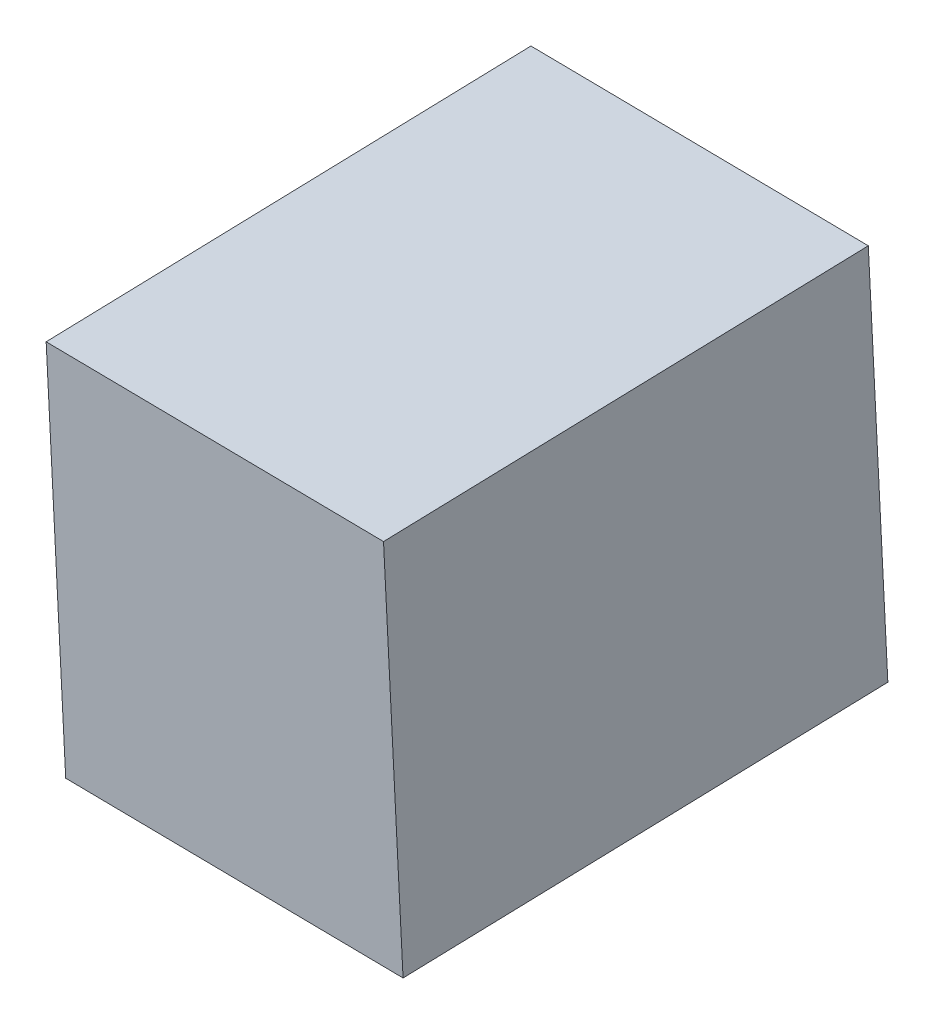
ISO-10303-21;
HEADER;
FILE_DESCRIPTION(('STEP AP214'),'2;1');
FILE_NAME('part.step','',(''),(''),'','','');
FILE_SCHEMA(('AUTOMOTIVE_DESIGN { 1 0 10303 214 1 1 1 1 }'));
ENDSEC;
DATA;
#1=APPLICATION_CONTEXT('core data for automotive mechanical design processes');
#2=APPLICATION_PROTOCOL_DEFINITION('international standard','automotive_design',2000,#1);
#3=PRODUCT_CONTEXT('',#1,'mechanical');
#4=PRODUCT('Part','Part','',(#3));
#5=PRODUCT_RELATED_PRODUCT_CATEGORY('part','',(#4));
#6=PRODUCT_DEFINITION_FORMATION('','',#4);
#7=PRODUCT_DEFINITION_CONTEXT('part definition',#1,'design');
#8=PRODUCT_DEFINITION('design','',#6,#7);
#9=PRODUCT_DEFINITION_SHAPE('','',#8);
#10=(LENGTH_UNIT() NAMED_UNIT(*) SI_UNIT(.MILLI.,.METRE.));
#11=(NAMED_UNIT(*) PLANE_ANGLE_UNIT() SI_UNIT($,.RADIAN.));
#12=(NAMED_UNIT(*) SI_UNIT($,.STERADIAN.) SOLID_ANGLE_UNIT());
#13=UNCERTAINTY_MEASURE_WITH_UNIT(LENGTH_MEASURE(1.E-05),#10,'distance_accuracy_value','');
#14=(GEOMETRIC_REPRESENTATION_CONTEXT(3) GLOBAL_UNCERTAINTY_ASSIGNED_CONTEXT((#13)) GLOBAL_UNIT_ASSIGNED_CONTEXT((#10,
#11,#12)) REPRESENTATION_CONTEXT('',''));
#15=CARTESIAN_POINT('',(0.,0.,0.));
#16=DIRECTION('',(0.,0.,1.));
#17=DIRECTION('',(1.,0.,0.));
#18=AXIS2_PLACEMENT_3D('',#15,#16,#17);
#19=CARTESIAN_POINT('',(-376.550879987825,45.8998384691677,513.344153182914));
#20=DIRECTION('',(0.00511954634939882,-0.998951279263532,-0.0454987022114782));
#21=DIRECTION('',(0.,0.0454992984781141,-0.998964370654929));
#22=AXIS2_PLACEMENT_3D('',#19,#20,#21);
#23=PLANE('',#22);
#24=DIRECTION('',(-0.0167454864162081,-0.0455785602369636,0.998820396032946));
#25=VECTOR('',#24,1.);
#26=CARTESIAN_POINT('',(-416.544747096268,45.7257740926726,512.665702517753));
#27=LINE('',#26,#25);
#28=CARTESIAN_POINT('',(-416.544747096268,45.7257740926726,512.665702517753));
#29=VERTEX_POINT('',#28);
#30=CARTESIAN_POINT('',(-417.476283189339,43.1902804751303,568.229167577775));
#31=VERTEX_POINT('',#30);
#32=EDGE_CURVE('E113',#29,#31,#27,.T.);
#33=ORIENTED_EDGE('',*,*,#32,.T.);
#34=DIRECTION('',(-0.999846677711068,-0.00435160941237813,-0.0169612666290335));
#35=VECTOR('',#34,1.);
#36=CARTESIAN_POINT('',(-377.482416080896,43.3643448516254,568.907618242937));
#37=LINE('',#36,#35);
#38=CARTESIAN_POINT('',(-377.482416080896,43.3643448516254,568.907618242937));
#39=VERTEX_POINT('',#38);
#40=EDGE_CURVE('E11',#39,#31,#37,.T.);
#41=ORIENTED_EDGE('',*,*,#40,.F.);
#42=DIRECTION('',(-0.0167454864162081,-0.0455785602369636,0.998820396032946));
#43=VECTOR('',#42,1.);
#44=CARTESIAN_POINT('',(-376.550879987825,45.8998384691677,513.344153182914));
#45=LINE('',#44,#43);
#46=CARTESIAN_POINT('',(-376.550879987825,45.8998384691677,513.344153182914));
#47=VERTEX_POINT('',#46);
#48=EDGE_CURVE('E114',#47,#39,#45,.T.);
#49=ORIENTED_EDGE('',*,*,#48,.F.);
#50=DIRECTION('',(-0.999846677711068,-0.00435160941237813,-0.0169612666290335));
#51=VECTOR('',#50,1.);
#52=CARTESIAN_POINT('',(-376.550879987825,45.8998384691677,513.344153182914));
#53=LINE('',#52,#51);
#54=EDGE_CURVE('E120',#47,#29,#53,.T.);
#55=ORIENTED_EDGE('',*,*,#54,.T.);
#56=EDGE_LOOP('',(#33,#41,#49,#55));
#57=FACE_BOUND('',#56,.T.);
#58=ADVANCED_FACE('F39',(#57),#23,.F.);
#59=CARTESIAN_POINT('',(-377.482416080896,43.3643448516254,568.907618242937));
#60=DIRECTION('',(0.0167454864162084,0.0455785602369645,-0.998820396032945));
#61=DIRECTION('',(0.,0.998960465761994,0.0455849519532412));
#62=AXIS2_PLACEMENT_3D('',#59,#60,#61);
#63=PLANE('',#62);
#64=DIRECTION('',(0.0051195463493993,-0.998951279263532,-0.0454987022114791));
#65=VECTOR('',#64,1.);
#66=CARTESIAN_POINT('',(-417.476283189339,43.1902804751303,568.229167577775));
#67=LINE('',#66,#65);
#68=CARTESIAN_POINT('',(-417.245884706905,-1.76621431173379,566.181558038412));
#69=VERTEX_POINT('',#68);
#70=EDGE_CURVE('E123',#31,#69,#67,.T.);
#71=ORIENTED_EDGE('',*,*,#70,.T.);
#72=DIRECTION('',(-0.999846677711068,-0.00435160941237813,-0.0169612666290335));
#73=VECTOR('',#72,1.);
#74=CARTESIAN_POINT('',(-377.252017598462,-1.59214993523866,566.860008703573));
#75=LINE('',#74,#73);
#76=CARTESIAN_POINT('',(-377.252017598462,-1.59214993523866,566.860008703573));
#77=VERTEX_POINT('',#76);
#78=EDGE_CURVE('E47',#77,#69,#75,.T.);
#79=ORIENTED_EDGE('',*,*,#78,.F.);
#80=DIRECTION('',(0.0051195463493993,-0.998951279263532,-0.0454987022114791));
#81=VECTOR('',#80,1.);
#82=CARTESIAN_POINT('',(-377.482416080896,43.3643448516254,568.907618242937));
#83=LINE('',#82,#81);
#84=EDGE_CURVE('E86',#39,#77,#83,.T.);
#85=ORIENTED_EDGE('',*,*,#84,.F.);
#86=ORIENTED_EDGE('',*,*,#40,.T.);
#87=EDGE_LOOP('',(#71,#79,#85,#86));
#88=FACE_BOUND('',#87,.T.);
#89=ADVANCED_FACE('F146',(#88),#63,.F.);
#90=CARTESIAN_POINT('',(-377.252017598462,-1.59214993523866,566.860008703573));
#91=DIRECTION('',(-0.00511954634939882,0.998951279263532,0.045498702211478));
#92=DIRECTION('',(0.,-0.045499298478114,0.99896437065493));
#93=AXIS2_PLACEMENT_3D('',#90,#91,#92);
#94=PLANE('',#93);
#95=DIRECTION('',(0.0167454864162081,0.0455785602369634,-0.998820396032946));
#96=VECTOR('',#95,1.);
#97=CARTESIAN_POINT('',(-417.245884706905,-1.76621431173379,566.181558038412));
#98=LINE('',#97,#96);
#99=CARTESIAN_POINT('',(-416.314348613834,0.769279305808546,510.618092978389));
#100=VERTEX_POINT('',#99);
#101=EDGE_CURVE('E73',#69,#100,#98,.T.);
#102=ORIENTED_EDGE('',*,*,#101,.T.);
#103=DIRECTION('',(-0.999846677711068,-0.00435160941237813,-0.0169612666290335));
#104=VECTOR('',#103,1.);
#105=CARTESIAN_POINT('',(-376.320481505391,0.943343682303671,511.296543643551));
#106=LINE('',#105,#104);
#107=CARTESIAN_POINT('',(-376.320481505391,0.943343682303671,511.296543643551));
#108=VERTEX_POINT('',#107);
#109=EDGE_CURVE('E128',#108,#100,#106,.T.);
#110=ORIENTED_EDGE('',*,*,#109,.F.);
#111=DIRECTION('',(0.0167454864162081,0.0455785602369634,-0.998820396032946));
#112=VECTOR('',#111,1.);
#113=CARTESIAN_POINT('',(-377.252017598462,-1.59214993523866,566.860008703573));
#114=LINE('',#113,#112);
#115=EDGE_CURVE('E117',#77,#108,#114,.T.);
#116=ORIENTED_EDGE('',*,*,#115,.F.);
#117=ORIENTED_EDGE('',*,*,#78,.T.);
#118=EDGE_LOOP('',(#102,#110,#116,#117));
#119=FACE_BOUND('',#118,.T.);
#120=ADVANCED_FACE('F130',(#119),#94,.F.);
#121=CARTESIAN_POINT('',(-376.320481505391,0.943343682303671,511.296543643551));
#122=DIRECTION('',(-0.0167454864162084,-0.0455785602369645,0.998820396032945));
#123=DIRECTION('',(0.,-0.998960465761994,-0.0455849519532412));
#124=AXIS2_PLACEMENT_3D('',#121,#122,#123);
#125=PLANE('',#124);
#126=DIRECTION('',(-0.0051195463493993,0.998951279263532,0.0454987022114791));
#127=VECTOR('',#126,1.);
#128=CARTESIAN_POINT('',(-416.314348613834,0.769279305808546,510.618092978389));
#129=LINE('',#128,#127);
#130=EDGE_CURVE('E79',#100,#29,#129,.T.);
#131=ORIENTED_EDGE('',*,*,#130,.T.);
#132=ORIENTED_EDGE('',*,*,#54,.F.);
#133=DIRECTION('',(-0.0051195463493993,0.998951279263532,0.0454987022114791));
#134=VECTOR('',#133,1.);
#135=CARTESIAN_POINT('',(-376.320481505391,0.943343682303671,511.296543643551));
#136=LINE('',#135,#134);
#137=EDGE_CURVE('E55',#108,#47,#136,.T.);
#138=ORIENTED_EDGE('',*,*,#137,.F.);
#139=ORIENTED_EDGE('',*,*,#109,.T.);
#140=EDGE_LOOP('',(#131,#132,#138,#139));
#141=FACE_BOUND('',#140,.T.);
#142=ADVANCED_FACE('F137',(#141),#125,.F.);
#143=CARTESIAN_POINT('',(-367.530081926774,-1.59959261704625,-6.23473163707586));
#144=DIRECTION('',(0.999846677711068,0.00435160941237861,0.0169612666290332));
#145=DIRECTION('',(0.0169614272248647,0.,-0.999856144646066));
#146=AXIS2_PLACEMENT_3D('',#143,#144,#145);
#147=PLANE('',#146);
#148=ORIENTED_EDGE('',*,*,#48,.T.);
#149=ORIENTED_EDGE('',*,*,#84,.T.);
#150=ORIENTED_EDGE('',*,*,#115,.T.);
#151=ORIENTED_EDGE('',*,*,#137,.T.);
#152=EDGE_LOOP('',(#148,#149,#150,#151));
#153=FACE_BOUND('',#152,.T.);
#154=ADVANCED_FACE('F139',(#153),#147,.T.);
#155=CARTESIAN_POINT('',(-407.523949035216,-1.77365699354138,-6.9131823022372));
#156=DIRECTION('',(0.999846677711068,0.00435160941237861,0.0169612666290332));
#157=DIRECTION('',(0.0169614272248647,0.,-0.999856144646066));
#158=AXIS2_PLACEMENT_3D('',#155,#156,#157);
#159=PLANE('',#158);
#160=CARTESIAN_POINT('',(-417.180820769731,18.6685968759062,557.103328122312));
#161=DIRECTION('',(-0.999846677711068,-0.00435160941237797,-0.0169612666290334));
#162=DIRECTION('',(-0.016961427224865,0.,0.999856144646066));
#163=AXIS2_PLACEMENT_3D('',#160,#161,#162);
#164=CIRCLE('',#163,4.40000000000003);
#165=CARTESIAN_POINT('',(-417.25545104952,18.6685968759062,561.502695158755));
#166=VERTEX_POINT('',#165);
#167=EDGE_CURVE('E102',#166,#166,#164,.T.);
#168=ORIENTED_EDGE('',*,*,#167,.F.);
#169=EDGE_LOOP('',(#168));
#170=FACE_BOUND('',#169,.T.);
#171=CARTESIAN_POINT('',(-416.762183609325,19.8080608818303,532.132818221488));
#172=DIRECTION('',(-0.999846677711068,-0.00435160941237797,-0.0169612666290334));
#173=DIRECTION('',(-0.016961427224865,0.,0.999856144646066));
#174=AXIS2_PLACEMENT_3D('',#171,#172,#173);
#175=CIRCLE('',#174,4.40000000000003);
#176=CARTESIAN_POINT('',(-416.836813889115,19.8080608818303,536.532185257931));
#177=VERTEX_POINT('',#176);
#178=EDGE_CURVE('E110',#177,#177,#175,.T.);
#179=ORIENTED_EDGE('',*,*,#178,.F.);
#180=EDGE_LOOP('',(#179));
#181=FACE_BOUND('',#180,.T.);
#182=ORIENTED_EDGE('',*,*,#32,.F.);
#183=ORIENTED_EDGE('',*,*,#130,.F.);
#184=ORIENTED_EDGE('',*,*,#101,.F.);
#185=ORIENTED_EDGE('',*,*,#70,.F.);
#186=EDGE_LOOP('',(#182,#183,#184,#185));
#187=FACE_BOUND('',#186,.T.);
#188=ADVANCED_FACE('F133',(#170,#181,#187),#159,.F.);
#189=CARTESIAN_POINT('',(-416.762183609325,19.8080608818303,532.132818221488));
#190=DIRECTION('',(-0.999846677711068,-0.00435160941237797,-0.0169612666290334));
#191=DIRECTION('',(-0.016961427224865,0.,0.999856144646066));
#192=AXIS2_PLACEMENT_3D('',#189,#190,#191);
#193=CYLINDRICAL_SURFACE('',#192,4.40000000000003);
#194=CARTESIAN_POINT('',(-406.763716832215,19.8515769759541,532.302430887779));
#195=DIRECTION('',(-0.999846677711068,-0.00435160941237797,-0.0169612666290334));
#196=DIRECTION('',(-0.016961427224865,0.,0.999856144646066));
#197=AXIS2_PLACEMENT_3D('',#194,#195,#196);
#198=CIRCLE('',#197,4.40000000000004);
#199=CARTESIAN_POINT('',(-406.838347112004,19.8515769759541,536.701797924221));
#200=VERTEX_POINT('',#199);
#201=EDGE_CURVE('E105',#200,#200,#198,.T.);
#202=ORIENTED_EDGE('',*,*,#201,.F.);
#203=EDGE_LOOP('',(#202));
#204=FACE_BOUND('',#203,.T.);
#205=ORIENTED_EDGE('',*,*,#178,.T.);
#206=EDGE_LOOP('',(#205));
#207=FACE_BOUND('',#206,.T.);
#208=ADVANCED_FACE('F181',(#204,#207),#193,.F.);
#209=CARTESIAN_POINT('',(-406.763716832215,19.8515769759541,532.302430887779));
#210=DIRECTION('',(-0.999846677711068,-0.00435160941237797,-0.0169612666290334));
#211=DIRECTION('',(-0.016961427224865,0.,0.999856144646066));
#212=AXIS2_PLACEMENT_3D('',#209,#210,#211);
#213=CONICAL_SURFACE('',#212,4.40000000000003,1.02974425867666);
#214=CARTESIAN_POINT('',(-404.120335459925,19.8630817031454,532.34727285931));
#215=VERTEX_POINT('',#214);
#216=VERTEX_LOOP('',#215);
#217=FACE_BOUND('',#216,.T.);
#218=ORIENTED_EDGE('',*,*,#201,.T.);
#219=EDGE_LOOP('',(#218));
#220=FACE_BOUND('',#219,.T.);
#221=ADVANCED_FACE('F191',(#217,#220),#213,.F.);
#222=CARTESIAN_POINT('',(-417.180820769731,18.6685968759062,557.103328122312));
#223=DIRECTION('',(-0.999846677711068,-0.00435160941237797,-0.0169612666290334));
#224=DIRECTION('',(-0.016961427224865,0.,0.999856144646066));
#225=AXIS2_PLACEMENT_3D('',#222,#223,#224);
#226=CYLINDRICAL_SURFACE('',#225,4.40000000000003);
#227=CARTESIAN_POINT('',(-407.18235399262,18.71211297003,557.272940788602));
#228=DIRECTION('',(-0.999846677711068,-0.00435160941237797,-0.0169612666290334));
#229=DIRECTION('',(-0.016961427224865,0.,0.999856144646066));
#230=AXIS2_PLACEMENT_3D('',#227,#228,#229);
#231=CIRCLE('',#230,4.40000000000004);
#232=CARTESIAN_POINT('',(-407.256984272409,18.71211297003,561.672307825045));
#233=VERTEX_POINT('',#232);
#234=EDGE_CURVE('E100',#233,#233,#231,.T.);
#235=ORIENTED_EDGE('',*,*,#234,.F.);
#236=EDGE_LOOP('',(#235));
#237=FACE_BOUND('',#236,.T.);
#238=ORIENTED_EDGE('',*,*,#167,.T.);
#239=EDGE_LOOP('',(#238));
#240=FACE_BOUND('',#239,.T.);
#241=ADVANCED_FACE('F96',(#237,#240),#226,.F.);
#242=CARTESIAN_POINT('',(-407.18235399262,18.71211297003,557.272940788602));
#243=DIRECTION('',(-0.999846677711068,-0.00435160941237797,-0.0169612666290334));
#244=DIRECTION('',(-0.016961427224865,0.,0.999856144646066));
#245=AXIS2_PLACEMENT_3D('',#242,#243,#244);
#246=CONICAL_SURFACE('',#245,4.40000000000003,1.02974425867666);
#247=CARTESIAN_POINT('',(-404.538972620331,18.7236176972213,557.317782760134));
#248=VERTEX_POINT('',#247);
#249=VERTEX_LOOP('',#248);
#250=FACE_BOUND('',#249,.T.);
#251=ORIENTED_EDGE('',*,*,#234,.T.);
#252=EDGE_LOOP('',(#251));
#253=FACE_BOUND('',#252,.T.);
#254=ADVANCED_FACE('F93',(#250,#253),#246,.F.);
#255=CLOSED_SHELL('',(#58,#89,#120,#142,#154,#188,#208,#221,#241,#254));
#256=MANIFOLD_SOLID_BREP('B2',#255);
#257=ADVANCED_BREP_SHAPE_REPRESENTATION('',(#18,#256),#14);
#258=SHAPE_DEFINITION_REPRESENTATION(#9,#257);
ENDSEC;
END-ISO-10303-21;
